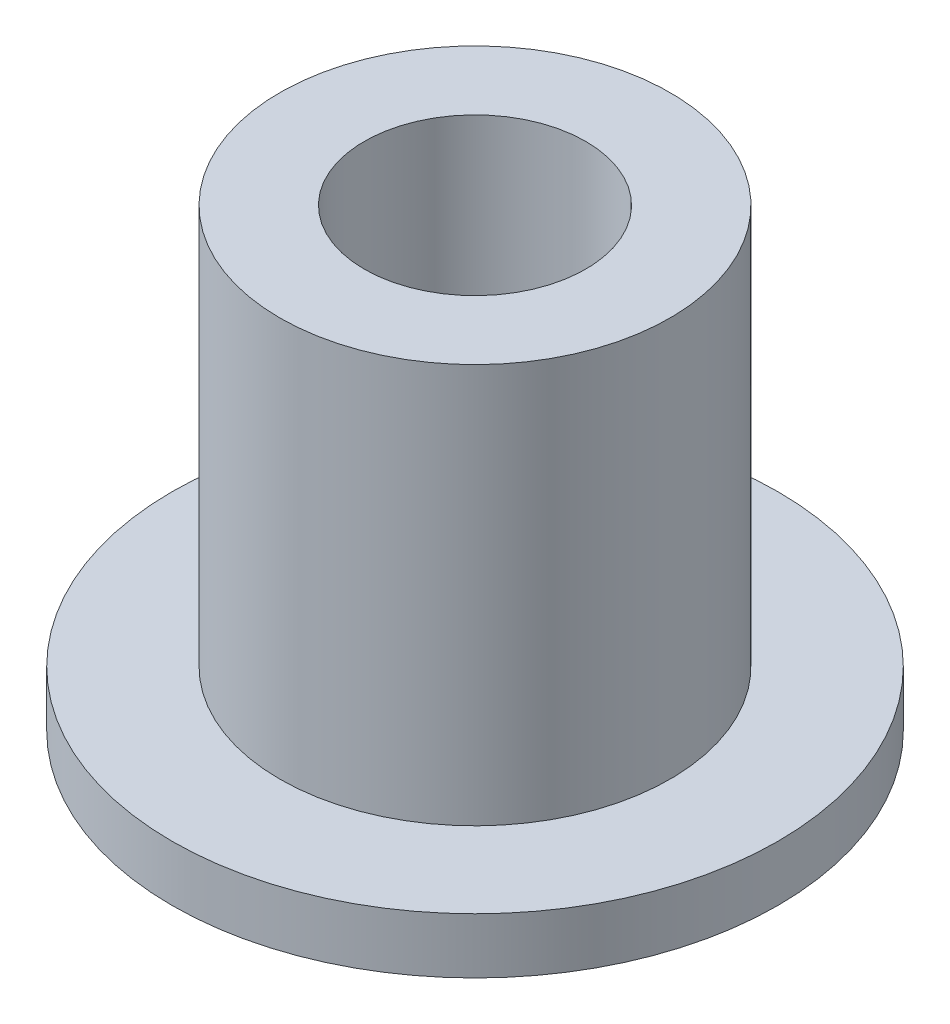
ISO-10303-21;
HEADER;
FILE_DESCRIPTION(('STEP AP214'),'2;1');
FILE_NAME('part.step','',(''),(''),'','','');
FILE_SCHEMA(('AUTOMOTIVE_DESIGN { 1 0 10303 214 1 1 1 1 }'));
ENDSEC;
DATA;
#1=APPLICATION_CONTEXT('core data for automotive mechanical design processes');
#2=APPLICATION_PROTOCOL_DEFINITION('international standard','automotive_design',2000,#1);
#3=PRODUCT_CONTEXT('',#1,'mechanical');
#4=PRODUCT('Part','Part','',(#3));
#5=PRODUCT_RELATED_PRODUCT_CATEGORY('part','',(#4));
#6=PRODUCT_DEFINITION_FORMATION('','',#4);
#7=PRODUCT_DEFINITION_CONTEXT('part definition',#1,'design');
#8=PRODUCT_DEFINITION('design','',#6,#7);
#9=PRODUCT_DEFINITION_SHAPE('','',#8);
#10=(LENGTH_UNIT() NAMED_UNIT(*) SI_UNIT(.MILLI.,.METRE.));
#11=(NAMED_UNIT(*) PLANE_ANGLE_UNIT() SI_UNIT($,.RADIAN.));
#12=(NAMED_UNIT(*) SI_UNIT($,.STERADIAN.) SOLID_ANGLE_UNIT());
#13=UNCERTAINTY_MEASURE_WITH_UNIT(LENGTH_MEASURE(1.E-05),#10,'distance_accuracy_value','');
#14=(GEOMETRIC_REPRESENTATION_CONTEXT(3) GLOBAL_UNCERTAINTY_ASSIGNED_CONTEXT((#13)) GLOBAL_UNIT_ASSIGNED_CONTEXT((#10,
#11,#12)) REPRESENTATION_CONTEXT('',''));
#15=CARTESIAN_POINT('',(0.,0.,0.));
#16=DIRECTION('',(0.,0.,1.));
#17=DIRECTION('',(1.,0.,0.));
#18=AXIS2_PLACEMENT_3D('',#15,#16,#17);
#19=CARTESIAN_POINT('',(0.,0.,0.));
#20=DIRECTION('',(0.,1.,0.));
#21=DIRECTION('',(0.,0.,1.));
#22=AXIS2_PLACEMENT_3D('',#19,#20,#21);
#23=CYLINDRICAL_SURFACE('',#22,2.19);
#24=CARTESIAN_POINT('',(0.,0.,0.));
#25=DIRECTION('',(0.,1.,0.));
#26=DIRECTION('',(0.,0.,1.));
#27=AXIS2_PLACEMENT_3D('',#24,#25,#26);
#28=CIRCLE('',#27,2.19);
#29=CARTESIAN_POINT('',(0.,0.,2.19));
#30=VERTEX_POINT('',#29);
#31=EDGE_CURVE('E10',#30,#30,#28,.T.);
#32=ORIENTED_EDGE('',*,*,#31,.F.);
#33=EDGE_LOOP('',(#32));
#34=FACE_BOUND('',#33,.T.);
#35=CARTESIAN_POINT('',(0.,9.,0.));
#36=DIRECTION('',(0.,1.,0.));
#37=DIRECTION('',(0.,0.,1.));
#38=AXIS2_PLACEMENT_3D('',#35,#36,#37);
#39=CIRCLE('',#38,2.19);
#40=CARTESIAN_POINT('',(0.,9.,2.19));
#41=VERTEX_POINT('',#40);
#42=EDGE_CURVE('E54',#41,#41,#39,.T.);
#43=ORIENTED_EDGE('',*,*,#42,.T.);
#44=EDGE_LOOP('',(#43));
#45=FACE_BOUND('',#44,.T.);
#46=ADVANCED_FACE('F32',(#34,#45),#23,.F.);
#47=CARTESIAN_POINT('',(0.,0.,0.));
#48=DIRECTION('',(0.,1.,0.));
#49=DIRECTION('',(0.,0.,1.));
#50=AXIS2_PLACEMENT_3D('',#47,#48,#49);
#51=PLANE('',#50);
#52=CARTESIAN_POINT('',(0.,0.,0.));
#53=DIRECTION('',(0.,1.,0.));
#54=DIRECTION('',(0.,0.,1.));
#55=AXIS2_PLACEMENT_3D('',#52,#53,#54);
#56=CIRCLE('',#55,5.99);
#57=CARTESIAN_POINT('',(0.,0.,5.99));
#58=VERTEX_POINT('',#57);
#59=EDGE_CURVE('E38',#58,#58,#56,.T.);
#60=ORIENTED_EDGE('',*,*,#59,.F.);
#61=EDGE_LOOP('',(#60));
#62=FACE_BOUND('',#61,.T.);
#63=ORIENTED_EDGE('',*,*,#31,.T.);
#64=EDGE_LOOP('',(#63));
#65=FACE_BOUND('',#64,.T.);
#66=ADVANCED_FACE('F79',(#62,#65),#51,.F.);
#67=CARTESIAN_POINT('',(0.,0.,0.));
#68=DIRECTION('',(0.,1.,0.));
#69=DIRECTION('',(0.,0.,1.));
#70=AXIS2_PLACEMENT_3D('',#67,#68,#69);
#71=CYLINDRICAL_SURFACE('',#70,5.99);
#72=CARTESIAN_POINT('',(0.,1.1,0.));
#73=DIRECTION('',(0.,1.,0.));
#74=DIRECTION('',(0.,0.,1.));
#75=AXIS2_PLACEMENT_3D('',#72,#73,#74);
#76=CIRCLE('',#75,5.99);
#77=CARTESIAN_POINT('',(0.,1.1,5.99));
#78=VERTEX_POINT('',#77);
#79=EDGE_CURVE('E42',#78,#78,#76,.T.);
#80=ORIENTED_EDGE('',*,*,#79,.F.);
#81=EDGE_LOOP('',(#80));
#82=FACE_BOUND('',#81,.T.);
#83=ORIENTED_EDGE('',*,*,#59,.T.);
#84=EDGE_LOOP('',(#83));
#85=FACE_BOUND('',#84,.T.);
#86=ADVANCED_FACE('F74',(#82,#85),#71,.T.);
#87=CARTESIAN_POINT('',(0.,1.1,0.));
#88=DIRECTION('',(0.,-1.,0.));
#89=DIRECTION('',(0.,0.,-1.));
#90=AXIS2_PLACEMENT_3D('',#87,#88,#89);
#91=PLANE('',#90);
#92=CARTESIAN_POINT('',(0.,1.1,0.));
#93=DIRECTION('',(0.,1.,0.));
#94=DIRECTION('',(0.,0.,1.));
#95=AXIS2_PLACEMENT_3D('',#92,#93,#94);
#96=CIRCLE('',#95,3.86);
#97=CARTESIAN_POINT('',(0.,1.1,3.86));
#98=VERTEX_POINT('',#97);
#99=EDGE_CURVE('E46',#98,#98,#96,.T.);
#100=ORIENTED_EDGE('',*,*,#99,.F.);
#101=EDGE_LOOP('',(#100));
#102=FACE_BOUND('',#101,.T.);
#103=ORIENTED_EDGE('',*,*,#79,.T.);
#104=EDGE_LOOP('',(#103));
#105=FACE_BOUND('',#104,.T.);
#106=ADVANCED_FACE('F68',(#102,#105),#91,.F.);
#107=CARTESIAN_POINT('',(0.,0.,0.));
#108=DIRECTION('',(0.,1.,0.));
#109=DIRECTION('',(0.,0.,1.));
#110=AXIS2_PLACEMENT_3D('',#107,#108,#109);
#111=CYLINDRICAL_SURFACE('',#110,3.86);
#112=CARTESIAN_POINT('',(0.,9.,0.));
#113=DIRECTION('',(0.,1.,0.));
#114=DIRECTION('',(0.,0.,1.));
#115=AXIS2_PLACEMENT_3D('',#112,#113,#114);
#116=CIRCLE('',#115,3.86);
#117=CARTESIAN_POINT('',(0.,9.,3.86));
#118=VERTEX_POINT('',#117);
#119=EDGE_CURVE('E51',#118,#118,#116,.T.);
#120=ORIENTED_EDGE('',*,*,#119,.F.);
#121=EDGE_LOOP('',(#120));
#122=FACE_BOUND('',#121,.T.);
#123=ORIENTED_EDGE('',*,*,#99,.T.);
#124=EDGE_LOOP('',(#123));
#125=FACE_BOUND('',#124,.T.);
#126=ADVANCED_FACE('F62',(#122,#125),#111,.T.);
#127=CARTESIAN_POINT('',(0.,9.,0.));
#128=DIRECTION('',(0.,-1.,0.));
#129=DIRECTION('',(0.,0.,-1.));
#130=AXIS2_PLACEMENT_3D('',#127,#128,#129);
#131=PLANE('',#130);
#132=ORIENTED_EDGE('',*,*,#42,.F.);
#133=EDGE_LOOP('',(#132));
#134=FACE_BOUND('',#133,.T.);
#135=ORIENTED_EDGE('',*,*,#119,.T.);
#136=EDGE_LOOP('',(#135));
#137=FACE_BOUND('',#136,.T.);
#138=ADVANCED_FACE('F59',(#134,#137),#131,.F.);
#139=CLOSED_SHELL('',(#46,#66,#86,#106,#126,#138));
#140=MANIFOLD_SOLID_BREP('B2',#139);
#141=ADVANCED_BREP_SHAPE_REPRESENTATION('',(#18,#140),#14);
#142=SHAPE_DEFINITION_REPRESENTATION(#9,#141);
ENDSEC;
END-ISO-10303-21;
